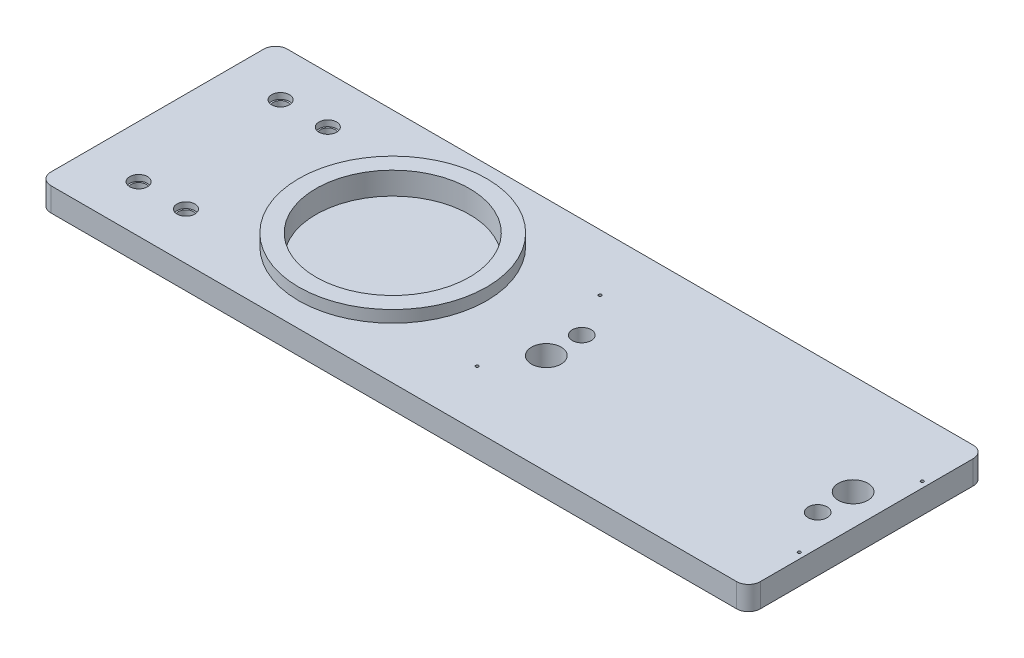
ISO-10303-21;
HEADER;
FILE_DESCRIPTION(('STEP AP214'),'2;1');
FILE_NAME('part.step','',(''),(''),'','','');
FILE_SCHEMA(('AUTOMOTIVE_DESIGN { 1 0 10303 214 1 1 1 1 }'));
ENDSEC;
DATA;
#1=APPLICATION_CONTEXT('core data for automotive mechanical design processes');
#2=APPLICATION_PROTOCOL_DEFINITION('international standard','automotive_design',2000,#1);
#3=PRODUCT_CONTEXT('',#1,'mechanical');
#4=PRODUCT('Part','Part','',(#3));
#5=PRODUCT_RELATED_PRODUCT_CATEGORY('part','',(#4));
#6=PRODUCT_DEFINITION_FORMATION('','',#4);
#7=PRODUCT_DEFINITION_CONTEXT('part definition',#1,'design');
#8=PRODUCT_DEFINITION('design','',#6,#7);
#9=PRODUCT_DEFINITION_SHAPE('','',#8);
#10=(LENGTH_UNIT() NAMED_UNIT(*) SI_UNIT(.MILLI.,.METRE.));
#11=(NAMED_UNIT(*) PLANE_ANGLE_UNIT() SI_UNIT($,.RADIAN.));
#12=(NAMED_UNIT(*) SI_UNIT($,.STERADIAN.) SOLID_ANGLE_UNIT());
#13=UNCERTAINTY_MEASURE_WITH_UNIT(LENGTH_MEASURE(1.E-05),#10,'distance_accuracy_value','');
#14=(GEOMETRIC_REPRESENTATION_CONTEXT(3) GLOBAL_UNCERTAINTY_ASSIGNED_CONTEXT((#13)) GLOBAL_UNIT_ASSIGNED_CONTEXT((#10,
#11,#12)) REPRESENTATION_CONTEXT('',''));
#15=CARTESIAN_POINT('',(0.,0.,0.));
#16=DIRECTION('',(0.,0.,1.));
#17=DIRECTION('',(1.,0.,0.));
#18=AXIS2_PLACEMENT_3D('',#15,#16,#17);
#19=CARTESIAN_POINT('',(-555.774,0.,-39.9999999999999));
#20=DIRECTION('',(0.,1.,0.));
#21=DIRECTION('',(0.,0.,1.));
#22=AXIS2_PLACEMENT_3D('',#19,#20,#21);
#23=CYLINDRICAL_SURFACE('',#22,6.25);
#24=CARTESIAN_POINT('',(-555.774,0.,-39.9999999999999));
#25=DIRECTION('',(0.,1.,0.));
#26=DIRECTION('',(0.,0.,1.));
#27=AXIS2_PLACEMENT_3D('',#24,#25,#26);
#28=CIRCLE('',#27,6.25);
#29=CARTESIAN_POINT('',(-555.774,0.,-33.7499999999999));
#30=VERTEX_POINT('',#29);
#31=EDGE_CURVE('E131',#30,#30,#28,.T.);
#32=ORIENTED_EDGE('',*,*,#31,.F.);
#33=EDGE_LOOP('',(#32));
#34=FACE_BOUND('',#33,.T.);
#35=CARTESIAN_POINT('',(-555.774,15.,-39.9999999999999));
#36=DIRECTION('',(0.,1.,0.));
#37=DIRECTION('',(0.,0.,1.));
#38=AXIS2_PLACEMENT_3D('',#35,#36,#37);
#39=CIRCLE('',#38,6.25);
#40=CARTESIAN_POINT('',(-555.774,15.,-33.7499999999999));
#41=VERTEX_POINT('',#40);
#42=EDGE_CURVE('E145',#41,#41,#39,.F.);
#43=ORIENTED_EDGE('',*,*,#42,.F.);
#44=EDGE_LOOP('',(#43));
#45=FACE_BOUND('',#44,.T.);
#46=ADVANCED_FACE('F33',(#34,#45),#23,.F.);
#47=CARTESIAN_POINT('',(-555.774,0.,-160.));
#48=DIRECTION('',(0.,1.,0.));
#49=DIRECTION('',(0.,0.,1.));
#50=AXIS2_PLACEMENT_3D('',#47,#48,#49);
#51=CYLINDRICAL_SURFACE('',#50,6.25);
#52=CARTESIAN_POINT('',(-555.774,0.,-160.));
#53=DIRECTION('',(0.,1.,0.));
#54=DIRECTION('',(0.,0.,1.));
#55=AXIS2_PLACEMENT_3D('',#52,#53,#54);
#56=CIRCLE('',#55,6.25);
#57=CARTESIAN_POINT('',(-555.774,0.,-153.75));
#58=VERTEX_POINT('',#57);
#59=EDGE_CURVE('E125',#58,#58,#56,.T.);
#60=ORIENTED_EDGE('',*,*,#59,.F.);
#61=EDGE_LOOP('',(#60));
#62=FACE_BOUND('',#61,.T.);
#63=CARTESIAN_POINT('',(-555.774,15.,-160.));
#64=DIRECTION('',(0.,1.,0.));
#65=DIRECTION('',(0.,0.,1.));
#66=AXIS2_PLACEMENT_3D('',#63,#64,#65);
#67=CIRCLE('',#66,6.25);
#68=CARTESIAN_POINT('',(-555.774,15.,-153.75));
#69=VERTEX_POINT('',#68);
#70=EDGE_CURVE('E140',#69,#69,#67,.F.);
#71=ORIENTED_EDGE('',*,*,#70,.F.);
#72=EDGE_LOOP('',(#71));
#73=FACE_BOUND('',#72,.T.);
#74=ADVANCED_FACE('F338',(#62,#73),#51,.F.);
#75=CARTESIAN_POINT('',(0.,20.,0.));
#76=DIRECTION('',(-1.,0.,0.));
#77=DIRECTION('',(0.,0.,1.));
#78=AXIS2_PLACEMENT_3D('',#75,#76,#77);
#79=PLANE('',#78);
#80=DIRECTION('',(0.,0.,-1.));
#81=VECTOR('',#80,1.);
#82=CARTESIAN_POINT('',(0.,20.,0.));
#83=LINE('',#82,#81);
#84=CARTESIAN_POINT('',(0.,20.,-10.));
#85=VERTEX_POINT('',#84);
#86=CARTESIAN_POINT('',(0.,20.,-190.));
#87=VERTEX_POINT('',#86);
#88=EDGE_CURVE('E118',#85,#87,#83,.T.);
#89=ORIENTED_EDGE('',*,*,#88,.F.);
#90=DIRECTION('',(0.,-1.,0.));
#91=VECTOR('',#90,1.);
#92=CARTESIAN_POINT('',(0.,20.,-10.));
#93=LINE('',#92,#91);
#94=CARTESIAN_POINT('',(0.,0.,-10.));
#95=VERTEX_POINT('',#94);
#96=EDGE_CURVE('E102',#85,#95,#93,.T.);
#97=ORIENTED_EDGE('',*,*,#96,.T.);
#98=DIRECTION('',(0.,0.,-1.));
#99=VECTOR('',#98,1.);
#100=CARTESIAN_POINT('',(0.,0.,0.));
#101=LINE('',#100,#99);
#102=CARTESIAN_POINT('',(0.,0.,-190.));
#103=VERTEX_POINT('',#102);
#104=EDGE_CURVE('E115',#95,#103,#101,.T.);
#105=ORIENTED_EDGE('',*,*,#104,.T.);
#106=DIRECTION('',(0.,-1.,0.));
#107=VECTOR('',#106,1.);
#108=CARTESIAN_POINT('',(0.,20.,-190.));
#109=LINE('',#108,#107);
#110=EDGE_CURVE('E120',#103,#87,#109,.F.);
#111=ORIENTED_EDGE('',*,*,#110,.T.);
#112=EDGE_LOOP('',(#89,#97,#105,#111));
#113=FACE_BOUND('',#112,.T.);
#114=ADVANCED_FACE('F114',(#113),#79,.F.);
#115=CARTESIAN_POINT('',(0.,20.,-200.));
#116=DIRECTION('',(0.,0.,1.));
#117=DIRECTION('',(1.,0.,0.));
#118=AXIS2_PLACEMENT_3D('',#115,#116,#117);
#119=PLANE('',#118);
#120=DIRECTION('',(-1.,0.,0.));
#121=VECTOR('',#120,1.);
#122=CARTESIAN_POINT('',(0.,20.,-200.));
#123=LINE('',#122,#121);
#124=CARTESIAN_POINT('',(-10.,20.,-200.));
#125=VERTEX_POINT('',#124);
#126=CARTESIAN_POINT('',(-590.,20.,-200.));
#127=VERTEX_POINT('',#126);
#128=EDGE_CURVE('E189',#125,#127,#123,.T.);
#129=ORIENTED_EDGE('',*,*,#128,.F.);
#130=DIRECTION('',(0.,-1.,0.));
#131=VECTOR('',#130,1.);
#132=CARTESIAN_POINT('',(-10.,20.,-200.));
#133=LINE('',#132,#131);
#134=CARTESIAN_POINT('',(-10.,0.,-200.));
#135=VERTEX_POINT('',#134);
#136=EDGE_CURVE('E173',#125,#135,#133,.T.);
#137=ORIENTED_EDGE('',*,*,#136,.T.);
#138=DIRECTION('',(-1.,0.,0.));
#139=VECTOR('',#138,1.);
#140=CARTESIAN_POINT('',(0.,0.,-200.));
#141=LINE('',#140,#139);
#142=CARTESIAN_POINT('',(-590.,0.,-200.));
#143=VERTEX_POINT('',#142);
#144=EDGE_CURVE('E124',#135,#143,#141,.T.);
#145=ORIENTED_EDGE('',*,*,#144,.T.);
#146=DIRECTION('',(0.,-1.,0.));
#147=VECTOR('',#146,1.);
#148=CARTESIAN_POINT('',(-590.,20.,-200.));
#149=LINE('',#148,#147);
#150=EDGE_CURVE('E171',#143,#127,#149,.F.);
#151=ORIENTED_EDGE('',*,*,#150,.T.);
#152=EDGE_LOOP('',(#129,#137,#145,#151));
#153=FACE_BOUND('',#152,.T.);
#154=ADVANCED_FACE('F361',(#153),#119,.F.);
#155=CARTESIAN_POINT('',(-600.,20.,0.));
#156=DIRECTION('',(1.,0.,0.));
#157=DIRECTION('',(0.,0.,-1.));
#158=AXIS2_PLACEMENT_3D('',#155,#156,#157);
#159=PLANE('',#158);
#160=DIRECTION('',(0.,0.,1.));
#161=VECTOR('',#160,1.);
#162=CARTESIAN_POINT('',(-600.,0.,0.));
#163=LINE('',#162,#161);
#164=CARTESIAN_POINT('',(-600.,0.,-190.));
#165=VERTEX_POINT('',#164);
#166=CARTESIAN_POINT('',(-600.,0.,-9.99999999999992));
#167=VERTEX_POINT('',#166);
#168=EDGE_CURVE('E128',#165,#167,#163,.T.);
#169=ORIENTED_EDGE('',*,*,#168,.T.);
#170=DIRECTION('',(0.,-1.,0.));
#171=VECTOR('',#170,1.);
#172=CARTESIAN_POINT('',(-600.,20.,-9.99999999999993));
#173=LINE('',#172,#171);
#174=CARTESIAN_POINT('',(-600.,20.,-9.99999999999992));
#175=VERTEX_POINT('',#174);
#176=EDGE_CURVE('E11',#167,#175,#173,.F.);
#177=ORIENTED_EDGE('',*,*,#176,.T.);
#178=DIRECTION('',(0.,0.,1.));
#179=VECTOR('',#178,1.);
#180=CARTESIAN_POINT('',(-600.,20.,0.));
#181=LINE('',#180,#179);
#182=CARTESIAN_POINT('',(-600.,20.,-190.));
#183=VERTEX_POINT('',#182);
#184=EDGE_CURVE('E179',#183,#175,#181,.T.);
#185=ORIENTED_EDGE('',*,*,#184,.F.);
#186=DIRECTION('',(0.,-1.,0.));
#187=VECTOR('',#186,1.);
#188=CARTESIAN_POINT('',(-600.,20.,-190.));
#189=LINE('',#188,#187);
#190=EDGE_CURVE('E41',#183,#165,#189,.T.);
#191=ORIENTED_EDGE('',*,*,#190,.T.);
#192=EDGE_LOOP('',(#169,#177,#185,#191));
#193=FACE_BOUND('',#192,.T.);
#194=ADVANCED_FACE('F178',(#193),#159,.F.);
#195=CARTESIAN_POINT('',(0.,20.,0.));
#196=DIRECTION('',(0.,0.,-1.));
#197=DIRECTION('',(-1.,0.,0.));
#198=AXIS2_PLACEMENT_3D('',#195,#196,#197);
#199=PLANE('',#198);
#200=DIRECTION('',(1.,0.,0.));
#201=VECTOR('',#200,1.);
#202=CARTESIAN_POINT('',(0.,0.,0.));
#203=LINE('',#202,#201);
#204=CARTESIAN_POINT('',(-590.,0.,0.));
#205=VERTEX_POINT('',#204);
#206=CARTESIAN_POINT('',(-10.,0.,0.));
#207=VERTEX_POINT('',#206);
#208=EDGE_CURVE('E138',#205,#207,#203,.T.);
#209=ORIENTED_EDGE('',*,*,#208,.T.);
#210=DIRECTION('',(0.,-1.,0.));
#211=VECTOR('',#210,1.);
#212=CARTESIAN_POINT('',(-10.,20.,0.));
#213=LINE('',#212,#211);
#214=CARTESIAN_POINT('',(-10.,20.,0.));
#215=VERTEX_POINT('',#214);
#216=EDGE_CURVE('E103',#207,#215,#213,.F.);
#217=ORIENTED_EDGE('',*,*,#216,.T.);
#218=DIRECTION('',(1.,0.,0.));
#219=VECTOR('',#218,1.);
#220=CARTESIAN_POINT('',(0.,20.,0.));
#221=LINE('',#220,#219);
#222=CARTESIAN_POINT('',(-590.,20.,0.));
#223=VERTEX_POINT('',#222);
#224=EDGE_CURVE('E134',#223,#215,#221,.T.);
#225=ORIENTED_EDGE('',*,*,#224,.F.);
#226=DIRECTION('',(0.,-1.,0.));
#227=VECTOR('',#226,1.);
#228=CARTESIAN_POINT('',(-590.,20.,0.));
#229=LINE('',#228,#227);
#230=EDGE_CURVE('E108',#223,#205,#229,.T.);
#231=ORIENTED_EDGE('',*,*,#230,.T.);
#232=EDGE_LOOP('',(#209,#217,#225,#231));
#233=FACE_BOUND('',#232,.T.);
#234=ADVANCED_FACE('F187',(#233),#199,.F.);
#235=CARTESIAN_POINT('',(0.,20.,0.));
#236=DIRECTION('',(0.,1.,0.));
#237=DIRECTION('',(0.,0.,1.));
#238=AXIS2_PLACEMENT_3D('',#235,#236,#237);
#239=PLANE('',#238);
#240=CARTESIAN_POINT('',(-26.5,20.,-85.));
#241=DIRECTION('',(0.,1.,0.));
#242=DIRECTION('',(0.,0.,1.));
#243=AXIS2_PLACEMENT_3D('',#240,#241,#242);
#244=CIRCLE('',#243,8.);
#245=CARTESIAN_POINT('',(-26.5,20.,-77.));
#246=VERTEX_POINT('',#245);
#247=EDGE_CURVE('E276',#246,#246,#244,.T.);
#248=ORIENTED_EDGE('',*,*,#247,.F.);
#249=EDGE_LOOP('',(#248));
#250=FACE_BOUND('',#249,.T.);
#251=CARTESIAN_POINT('',(-256.,20.,-115.));
#252=DIRECTION('',(0.,1.,0.));
#253=DIRECTION('',(0.,0.,1.));
#254=AXIS2_PLACEMENT_3D('',#251,#252,#253);
#255=CIRCLE('',#254,8.00000000000001);
#256=CARTESIAN_POINT('',(-256.,20.,-107.));
#257=VERTEX_POINT('',#256);
#258=EDGE_CURVE('E270',#257,#257,#255,.T.);
#259=ORIENTED_EDGE('',*,*,#258,.F.);
#260=EDGE_LOOP('',(#259));
#261=FACE_BOUND('',#260,.T.);
#262=CARTESIAN_POINT('',(-256.,20.,-85.));
#263=DIRECTION('',(0.,1.,0.));
#264=DIRECTION('',(0.,0.,1.));
#265=AXIS2_PLACEMENT_3D('',#262,#263,#264);
#266=CIRCLE('',#265,12.5);
#267=CARTESIAN_POINT('',(-256.,20.,-72.5));
#268=VERTEX_POINT('',#267);
#269=EDGE_CURVE('E264',#268,#268,#266,.T.);
#270=ORIENTED_EDGE('',*,*,#269,.F.);
#271=EDGE_LOOP('',(#270));
#272=FACE_BOUND('',#271,.T.);
#273=CARTESIAN_POINT('',(-26.5,20.,-115.));
#274=DIRECTION('',(0.,1.,0.));
#275=DIRECTION('',(0.,0.,1.));
#276=AXIS2_PLACEMENT_3D('',#273,#274,#275);
#277=CIRCLE('',#276,12.5);
#278=CARTESIAN_POINT('',(-26.5,20.,-102.5));
#279=VERTEX_POINT('',#278);
#280=EDGE_CURVE('E258',#279,#279,#277,.T.);
#281=ORIENTED_EDGE('',*,*,#280,.F.);
#282=EDGE_LOOP('',(#281));
#283=FACE_BOUND('',#282,.T.);
#284=CARTESIAN_POINT('',(-400.86710702331,20.,-99.9999999999999));
#285=DIRECTION('',(0.,1.,0.));
#286=DIRECTION('',(0.,0.,1.));
#287=AXIS2_PLACEMENT_3D('',#284,#285,#286);
#288=CIRCLE('',#287,79.491583247583);
#289=CARTESIAN_POINT('',(-400.86710702331,20.,-20.508416752417));
#290=VERTEX_POINT('',#289);
#291=EDGE_CURVE('E246',#290,#290,#288,.T.);
#292=ORIENTED_EDGE('',*,*,#291,.F.);
#293=EDGE_LOOP('',(#292));
#294=FACE_BOUND('',#293,.T.);
#295=CARTESIAN_POINT('',(-277.5,20.,-152.));
#296=DIRECTION('',(0.,1.,0.));
#297=DIRECTION('',(0.,0.,-1.));
#298=AXIS2_PLACEMENT_3D('',#295,#296,#297);
#299=CIRCLE('',#298,1.24999999999995);
#300=CARTESIAN_POINT('',(-277.5,20.,-153.25));
#301=VERTEX_POINT('',#300);
#302=EDGE_CURVE('E241',#301,#301,#299,.T.);
#303=ORIENTED_EDGE('',*,*,#302,.F.);
#304=EDGE_LOOP('',(#303));
#305=FACE_BOUND('',#304,.T.);
#306=CARTESIAN_POINT('',(-5.,20.,-47.9999999999999));
#307=DIRECTION('',(0.,1.,0.));
#308=DIRECTION('',(0.,0.,-1.));
#309=AXIS2_PLACEMENT_3D('',#306,#307,#308);
#310=CIRCLE('',#309,1.24999999999996);
#311=CARTESIAN_POINT('',(-5.,20.,-49.2499999999999));
#312=VERTEX_POINT('',#311);
#313=EDGE_CURVE('E235',#312,#312,#310,.T.);
#314=ORIENTED_EDGE('',*,*,#313,.F.);
#315=EDGE_LOOP('',(#314));
#316=FACE_BOUND('',#315,.T.);
#317=CARTESIAN_POINT('',(-5.,20.,-152.));
#318=DIRECTION('',(0.,1.,0.));
#319=DIRECTION('',(0.,0.,1.));
#320=AXIS2_PLACEMENT_3D('',#317,#318,#319);
#321=CIRCLE('',#320,1.24999999999995);
#322=CARTESIAN_POINT('',(-5.,20.,-150.75));
#323=VERTEX_POINT('',#322);
#324=EDGE_CURVE('E228',#323,#323,#321,.T.);
#325=ORIENTED_EDGE('',*,*,#324,.F.);
#326=EDGE_LOOP('',(#325));
#327=FACE_BOUND('',#326,.T.);
#328=CARTESIAN_POINT('',(-277.5,20.,-47.9999999999999));
#329=DIRECTION('',(0.,1.,0.));
#330=DIRECTION('',(0.,0.,1.));
#331=AXIS2_PLACEMENT_3D('',#328,#329,#330);
#332=CIRCLE('',#331,1.24999999999996);
#333=CARTESIAN_POINT('',(-277.5,20.,-46.75));
#334=VERTEX_POINT('',#333);
#335=EDGE_CURVE('E222',#334,#334,#332,.T.);
#336=ORIENTED_EDGE('',*,*,#335,.F.);
#337=EDGE_LOOP('',(#336));
#338=FACE_BOUND('',#337,.T.);
#339=CARTESIAN_POINT('',(-555.774,20.,-39.9999999999999));
#340=DIRECTION('',(0.,1.,0.));
#341=DIRECTION('',(0.,0.,1.));
#342=AXIS2_PLACEMENT_3D('',#339,#340,#341);
#343=CIRCLE('',#342,7.50000000000007);
#344=CARTESIAN_POINT('',(-555.774,20.,-32.4999999999999));
#345=VERTEX_POINT('',#344);
#346=EDGE_CURVE('E217',#345,#345,#343,.T.);
#347=ORIENTED_EDGE('',*,*,#346,.F.);
#348=EDGE_LOOP('',(#347));
#349=FACE_BOUND('',#348,.T.);
#350=CARTESIAN_POINT('',(-515.774,20.,-39.9999999999999));
#351=DIRECTION('',(0.,1.,0.));
#352=DIRECTION('',(0.,0.,-1.));
#353=AXIS2_PLACEMENT_3D('',#350,#351,#352);
#354=CIRCLE('',#353,7.50000000000007);
#355=CARTESIAN_POINT('',(-515.774,20.,-47.5));
#356=VERTEX_POINT('',#355);
#357=EDGE_CURVE('E211',#356,#356,#354,.T.);
#358=ORIENTED_EDGE('',*,*,#357,.F.);
#359=EDGE_LOOP('',(#358));
#360=FACE_BOUND('',#359,.T.);
#361=CARTESIAN_POINT('',(-515.774,20.,-160.));
#362=DIRECTION('',(0.,1.,0.));
#363=DIRECTION('',(0.,0.,-1.));
#364=AXIS2_PLACEMENT_3D('',#361,#362,#363);
#365=CIRCLE('',#364,7.50000000000007);
#366=CARTESIAN_POINT('',(-515.774,20.,-167.5));
#367=VERTEX_POINT('',#366);
#368=EDGE_CURVE('E204',#367,#367,#365,.T.);
#369=ORIENTED_EDGE('',*,*,#368,.F.);
#370=EDGE_LOOP('',(#369));
#371=FACE_BOUND('',#370,.T.);
#372=CARTESIAN_POINT('',(-555.774,20.,-160.));
#373=DIRECTION('',(0.,1.,0.));
#374=DIRECTION('',(0.,0.,1.));
#375=AXIS2_PLACEMENT_3D('',#372,#373,#374);
#376=CIRCLE('',#375,7.50000000000007);
#377=CARTESIAN_POINT('',(-555.774,20.,-152.5));
#378=VERTEX_POINT('',#377);
#379=EDGE_CURVE('E155',#378,#378,#376,.T.);
#380=ORIENTED_EDGE('',*,*,#379,.F.);
#381=EDGE_LOOP('',(#380));
#382=FACE_BOUND('',#381,.T.);
#383=ORIENTED_EDGE('',*,*,#224,.T.);
#384=CARTESIAN_POINT('',(-10.,20.,-10.));
#385=DIRECTION('',(0.,1.,0.));
#386=DIRECTION('',(0.,0.,1.));
#387=AXIS2_PLACEMENT_3D('',#384,#385,#386);
#388=CIRCLE('',#387,10.);
#389=EDGE_CURVE('E169',#215,#85,#388,.T.);
#390=ORIENTED_EDGE('',*,*,#389,.T.);
#391=ORIENTED_EDGE('',*,*,#88,.T.);
#392=CARTESIAN_POINT('',(-10.,20.,-190.));
#393=DIRECTION('',(0.,1.,0.));
#394=DIRECTION('',(0.,0.,1.));
#395=AXIS2_PLACEMENT_3D('',#392,#393,#394);
#396=CIRCLE('',#395,10.);
#397=EDGE_CURVE('E167',#87,#125,#396,.T.);
#398=ORIENTED_EDGE('',*,*,#397,.T.);
#399=ORIENTED_EDGE('',*,*,#128,.T.);
#400=CARTESIAN_POINT('',(-590.,20.,-190.));
#401=DIRECTION('',(0.,1.,0.));
#402=DIRECTION('',(0.,0.,1.));
#403=AXIS2_PLACEMENT_3D('',#400,#401,#402);
#404=CIRCLE('',#403,10.);
#405=EDGE_CURVE('E53',#127,#183,#404,.T.);
#406=ORIENTED_EDGE('',*,*,#405,.T.);
#407=ORIENTED_EDGE('',*,*,#184,.T.);
#408=CARTESIAN_POINT('',(-590.,20.,-9.99999999999993));
#409=DIRECTION('',(0.,1.,0.));
#410=DIRECTION('',(0.,0.,1.));
#411=AXIS2_PLACEMENT_3D('',#408,#409,#410);
#412=CIRCLE('',#411,10.);
#413=EDGE_CURVE('E165',#175,#223,#412,.T.);
#414=ORIENTED_EDGE('',*,*,#413,.T.);
#415=EDGE_LOOP('',(#383,#390,#391,#398,#399,#406,#407,#414));
#416=FACE_BOUND('',#415,.T.);
#417=ADVANCED_FACE('F291',(#250,#261,#272,#283,#294,#305,#316,#327,#338,#349,#360,#371,#382,
#416),#239,.T.);
#418=CARTESIAN_POINT('',(0.,0.,0.));
#419=DIRECTION('',(0.,1.,0.));
#420=DIRECTION('',(0.,0.,1.));
#421=AXIS2_PLACEMENT_3D('',#418,#419,#420);
#422=PLANE('',#421);
#423=CARTESIAN_POINT('',(-26.5,0.,-85.));
#424=DIRECTION('',(0.,1.,0.));
#425=DIRECTION('',(0.,0.,1.));
#426=AXIS2_PLACEMENT_3D('',#423,#424,#425);
#427=CIRCLE('',#426,8.);
#428=CARTESIAN_POINT('',(-26.5,0.,-77.));
#429=VERTEX_POINT('',#428);
#430=EDGE_CURVE('E261',#429,#429,#427,.T.);
#431=ORIENTED_EDGE('',*,*,#430,.T.);
#432=EDGE_LOOP('',(#431));
#433=FACE_BOUND('',#432,.T.);
#434=CARTESIAN_POINT('',(-256.,0.,-115.));
#435=DIRECTION('',(0.,1.,0.));
#436=DIRECTION('',(0.,0.,1.));
#437=AXIS2_PLACEMENT_3D('',#434,#435,#436);
#438=CIRCLE('',#437,8.00000000000001);
#439=CARTESIAN_POINT('',(-256.,0.,-107.));
#440=VERTEX_POINT('',#439);
#441=EDGE_CURVE('E273',#440,#440,#438,.T.);
#442=ORIENTED_EDGE('',*,*,#441,.T.);
#443=EDGE_LOOP('',(#442));
#444=FACE_BOUND('',#443,.T.);
#445=CARTESIAN_POINT('',(-256.,0.,-85.));
#446=DIRECTION('',(0.,1.,0.));
#447=DIRECTION('',(0.,0.,1.));
#448=AXIS2_PLACEMENT_3D('',#445,#446,#447);
#449=CIRCLE('',#448,12.5);
#450=CARTESIAN_POINT('',(-256.,0.,-72.5));
#451=VERTEX_POINT('',#450);
#452=EDGE_CURVE('E267',#451,#451,#449,.T.);
#453=ORIENTED_EDGE('',*,*,#452,.T.);
#454=EDGE_LOOP('',(#453));
#455=FACE_BOUND('',#454,.T.);
#456=CARTESIAN_POINT('',(-26.5,0.,-115.));
#457=DIRECTION('',(0.,1.,0.));
#458=DIRECTION('',(0.,0.,1.));
#459=AXIS2_PLACEMENT_3D('',#456,#457,#458);
#460=CIRCLE('',#459,12.5);
#461=CARTESIAN_POINT('',(-26.5,0.,-102.5));
#462=VERTEX_POINT('',#461);
#463=EDGE_CURVE('E255',#462,#462,#460,.T.);
#464=ORIENTED_EDGE('',*,*,#463,.T.);
#465=EDGE_LOOP('',(#464));
#466=FACE_BOUND('',#465,.T.);
#467=CARTESIAN_POINT('',(-277.5,0.,-152.));
#468=DIRECTION('',(0.,1.,0.));
#469=DIRECTION('',(0.,0.,-1.));
#470=AXIS2_PLACEMENT_3D('',#467,#468,#469);
#471=CIRCLE('',#470,1.24999999999995);
#472=CARTESIAN_POINT('',(-277.5,0.,-153.25));
#473=VERTEX_POINT('',#472);
#474=EDGE_CURVE('E225',#473,#473,#471,.T.);
#475=ORIENTED_EDGE('',*,*,#474,.T.);
#476=EDGE_LOOP('',(#475));
#477=FACE_BOUND('',#476,.T.);
#478=CARTESIAN_POINT('',(-5.,0.,-47.9999999999999));
#479=DIRECTION('',(0.,1.,0.));
#480=DIRECTION('',(0.,0.,-1.));
#481=AXIS2_PLACEMENT_3D('',#478,#479,#480);
#482=CIRCLE('',#481,1.24999999999996);
#483=CARTESIAN_POINT('',(-5.,0.,-49.2499999999999));
#484=VERTEX_POINT('',#483);
#485=EDGE_CURVE('E238',#484,#484,#482,.T.);
#486=ORIENTED_EDGE('',*,*,#485,.T.);
#487=EDGE_LOOP('',(#486));
#488=FACE_BOUND('',#487,.T.);
#489=CARTESIAN_POINT('',(-5.,0.,-152.));
#490=DIRECTION('',(0.,1.,0.));
#491=DIRECTION('',(0.,0.,1.));
#492=AXIS2_PLACEMENT_3D('',#489,#490,#491);
#493=CIRCLE('',#492,1.24999999999995);
#494=CARTESIAN_POINT('',(-5.,0.,-150.75));
#495=VERTEX_POINT('',#494);
#496=EDGE_CURVE('E231',#495,#495,#493,.T.);
#497=ORIENTED_EDGE('',*,*,#496,.T.);
#498=EDGE_LOOP('',(#497));
#499=FACE_BOUND('',#498,.T.);
#500=CARTESIAN_POINT('',(-277.5,0.,-47.9999999999999));
#501=DIRECTION('',(0.,1.,0.));
#502=DIRECTION('',(0.,0.,1.));
#503=AXIS2_PLACEMENT_3D('',#500,#501,#502);
#504=CIRCLE('',#503,1.24999999999996);
#505=CARTESIAN_POINT('',(-277.5,0.,-46.75));
#506=VERTEX_POINT('',#505);
#507=EDGE_CURVE('E208',#506,#506,#504,.T.);
#508=ORIENTED_EDGE('',*,*,#507,.T.);
#509=EDGE_LOOP('',(#508));
#510=FACE_BOUND('',#509,.T.);
#511=ORIENTED_EDGE('',*,*,#31,.T.);
#512=EDGE_LOOP('',(#511));
#513=FACE_BOUND('',#512,.T.);
#514=CARTESIAN_POINT('',(-515.774,0.,-39.9999999999999));
#515=DIRECTION('',(0.,1.,0.));
#516=DIRECTION('',(0.,0.,-1.));
#517=AXIS2_PLACEMENT_3D('',#514,#515,#516);
#518=CIRCLE('',#517,6.25);
#519=CARTESIAN_POINT('',(-515.774,0.,-46.2499999999999));
#520=VERTEX_POINT('',#519);
#521=EDGE_CURVE('E195',#520,#520,#518,.T.);
#522=ORIENTED_EDGE('',*,*,#521,.T.);
#523=EDGE_LOOP('',(#522));
#524=FACE_BOUND('',#523,.T.);
#525=CARTESIAN_POINT('',(-515.774,0.,-160.));
#526=DIRECTION('',(0.,1.,0.));
#527=DIRECTION('',(0.,0.,-1.));
#528=AXIS2_PLACEMENT_3D('',#525,#526,#527);
#529=CIRCLE('',#528,6.25);
#530=CARTESIAN_POINT('',(-515.774,0.,-166.25));
#531=VERTEX_POINT('',#530);
#532=EDGE_CURVE('E143',#531,#531,#529,.T.);
#533=ORIENTED_EDGE('',*,*,#532,.T.);
#534=EDGE_LOOP('',(#533));
#535=FACE_BOUND('',#534,.T.);
#536=ORIENTED_EDGE('',*,*,#59,.T.);
#537=EDGE_LOOP('',(#536));
#538=FACE_BOUND('',#537,.T.);
#539=ORIENTED_EDGE('',*,*,#104,.F.);
#540=CARTESIAN_POINT('',(-10.,0.,-10.));
#541=DIRECTION('',(0.,1.,0.));
#542=DIRECTION('',(0.,0.,1.));
#543=AXIS2_PLACEMENT_3D('',#540,#541,#542);
#544=CIRCLE('',#543,10.);
#545=EDGE_CURVE('E98',#95,#207,#544,.F.);
#546=ORIENTED_EDGE('',*,*,#545,.T.);
#547=ORIENTED_EDGE('',*,*,#208,.F.);
#548=CARTESIAN_POINT('',(-590.,0.,-9.99999999999993));
#549=DIRECTION('',(0.,1.,0.));
#550=DIRECTION('',(0.,0.,1.));
#551=AXIS2_PLACEMENT_3D('',#548,#549,#550);
#552=CIRCLE('',#551,10.);
#553=EDGE_CURVE('E158',#205,#167,#552,.F.);
#554=ORIENTED_EDGE('',*,*,#553,.T.);
#555=ORIENTED_EDGE('',*,*,#168,.F.);
#556=CARTESIAN_POINT('',(-590.,0.,-190.));
#557=DIRECTION('',(0.,1.,0.));
#558=DIRECTION('',(0.,0.,1.));
#559=AXIS2_PLACEMENT_3D('',#556,#557,#558);
#560=CIRCLE('',#559,10.);
#561=EDGE_CURVE('E119',#165,#143,#560,.F.);
#562=ORIENTED_EDGE('',*,*,#561,.T.);
#563=ORIENTED_EDGE('',*,*,#144,.F.);
#564=CARTESIAN_POINT('',(-10.,0.,-190.));
#565=DIRECTION('',(0.,1.,0.));
#566=DIRECTION('',(0.,0.,1.));
#567=AXIS2_PLACEMENT_3D('',#564,#565,#566);
#568=CIRCLE('',#567,10.);
#569=EDGE_CURVE('E109',#135,#103,#568,.F.);
#570=ORIENTED_EDGE('',*,*,#569,.T.);
#571=EDGE_LOOP('',(#539,#546,#547,#554,#555,#562,#563,#570));
#572=FACE_BOUND('',#571,.T.);
#573=ADVANCED_FACE('F122',(#433,#444,#455,#466,#477,#488,#499,#510,#513,#524,#535,#538,#572),
#422,.F.);
#574=CARTESIAN_POINT('',(-515.774,0.,-160.));
#575=DIRECTION('',(0.,1.,0.));
#576=DIRECTION('',(0.,0.,1.));
#577=AXIS2_PLACEMENT_3D('',#574,#575,#576);
#578=CYLINDRICAL_SURFACE('',#577,6.25);
#579=CARTESIAN_POINT('',(-515.774,15.,-160.));
#580=DIRECTION('',(0.,-1.,0.));
#581=DIRECTION('',(0.,0.,-1.));
#582=AXIS2_PLACEMENT_3D('',#579,#580,#581);
#583=CIRCLE('',#582,6.25);
#584=CARTESIAN_POINT('',(-515.774,15.,-166.25));
#585=VERTEX_POINT('',#584);
#586=EDGE_CURVE('E152',#585,#585,#583,.F.);
#587=ORIENTED_EDGE('',*,*,#586,.T.);
#588=EDGE_LOOP('',(#587));
#589=FACE_BOUND('',#588,.T.);
#590=ORIENTED_EDGE('',*,*,#532,.F.);
#591=EDGE_LOOP('',(#590));
#592=FACE_BOUND('',#591,.T.);
#593=ADVANCED_FACE('F350',(#589,#592),#578,.F.);
#594=CARTESIAN_POINT('',(-515.774,0.,-39.9999999999999));
#595=DIRECTION('',(0.,1.,0.));
#596=DIRECTION('',(0.,0.,1.));
#597=AXIS2_PLACEMENT_3D('',#594,#595,#596);
#598=CYLINDRICAL_SURFACE('',#597,6.25);
#599=CARTESIAN_POINT('',(-515.774,15.,-39.9999999999999));
#600=DIRECTION('',(0.,-1.,0.));
#601=DIRECTION('',(0.,0.,-1.));
#602=AXIS2_PLACEMENT_3D('',#599,#600,#601);
#603=CIRCLE('',#602,6.25);
#604=CARTESIAN_POINT('',(-515.774,15.,-46.2499999999999));
#605=VERTEX_POINT('',#604);
#606=EDGE_CURVE('E148',#605,#605,#603,.F.);
#607=ORIENTED_EDGE('',*,*,#606,.T.);
#608=EDGE_LOOP('',(#607));
#609=FACE_BOUND('',#608,.T.);
#610=ORIENTED_EDGE('',*,*,#521,.F.);
#611=EDGE_LOOP('',(#610));
#612=FACE_BOUND('',#611,.T.);
#613=ADVANCED_FACE('F332',(#609,#612),#598,.F.);
#614=CARTESIAN_POINT('',(-555.774,15.,-160.));
#615=DIRECTION('',(0.,1.,0.));
#616=DIRECTION('',(0.,0.,1.));
#617=AXIS2_PLACEMENT_3D('',#614,#615,#616);
#618=PLANE('',#617);
#619=CARTESIAN_POINT('',(-555.774,15.,-160.));
#620=DIRECTION('',(0.,1.,0.));
#621=DIRECTION('',(0.,0.,1.));
#622=AXIS2_PLACEMENT_3D('',#619,#620,#621);
#623=CIRCLE('',#622,7.50000000000007);
#624=CARTESIAN_POINT('',(-555.774,15.,-152.5));
#625=VERTEX_POINT('',#624);
#626=EDGE_CURVE('E144',#625,#625,#623,.T.);
#627=ORIENTED_EDGE('',*,*,#626,.T.);
#628=EDGE_LOOP('',(#627));
#629=FACE_BOUND('',#628,.T.);
#630=ORIENTED_EDGE('',*,*,#70,.T.);
#631=EDGE_LOOP('',(#630));
#632=FACE_BOUND('',#631,.T.);
#633=ADVANCED_FACE('F322',(#629,#632),#618,.T.);
#634=CARTESIAN_POINT('',(-555.774,15.,-160.));
#635=DIRECTION('',(0.,1.,0.));
#636=DIRECTION('',(0.,0.,1.));
#637=AXIS2_PLACEMENT_3D('',#634,#635,#636);
#638=CYLINDRICAL_SURFACE('',#637,7.50000000000007);
#639=ORIENTED_EDGE('',*,*,#626,.F.);
#640=EDGE_LOOP('',(#639));
#641=FACE_BOUND('',#640,.T.);
#642=ORIENTED_EDGE('',*,*,#379,.T.);
#643=EDGE_LOOP('',(#642));
#644=FACE_BOUND('',#643,.T.);
#645=ADVANCED_FACE('F319',(#641,#644),#638,.F.);
#646=CARTESIAN_POINT('',(-555.774,15.,-39.9999999999999));
#647=DIRECTION('',(0.,1.,0.));
#648=DIRECTION('',(0.,0.,1.));
#649=AXIS2_PLACEMENT_3D('',#646,#647,#648);
#650=PLANE('',#649);
#651=CARTESIAN_POINT('',(-555.774,15.,-39.9999999999999));
#652=DIRECTION('',(0.,1.,0.));
#653=DIRECTION('',(0.,0.,1.));
#654=AXIS2_PLACEMENT_3D('',#651,#652,#653);
#655=CIRCLE('',#654,7.50000000000007);
#656=CARTESIAN_POINT('',(-555.774,15.,-32.4999999999999));
#657=VERTEX_POINT('',#656);
#658=EDGE_CURVE('E149',#657,#657,#655,.T.);
#659=ORIENTED_EDGE('',*,*,#658,.T.);
#660=EDGE_LOOP('',(#659));
#661=FACE_BOUND('',#660,.T.);
#662=ORIENTED_EDGE('',*,*,#42,.T.);
#663=EDGE_LOOP('',(#662));
#664=FACE_BOUND('',#663,.T.);
#665=ADVANCED_FACE('F321',(#661,#664),#650,.T.);
#666=CARTESIAN_POINT('',(-555.774,15.,-39.9999999999999));
#667=DIRECTION('',(0.,1.,0.));
#668=DIRECTION('',(0.,0.,1.));
#669=AXIS2_PLACEMENT_3D('',#666,#667,#668);
#670=CYLINDRICAL_SURFACE('',#669,7.50000000000007);
#671=ORIENTED_EDGE('',*,*,#658,.F.);
#672=EDGE_LOOP('',(#671));
#673=FACE_BOUND('',#672,.T.);
#674=ORIENTED_EDGE('',*,*,#346,.T.);
#675=EDGE_LOOP('',(#674));
#676=FACE_BOUND('',#675,.T.);
#677=ADVANCED_FACE('F329',(#673,#676),#670,.F.);
#678=CARTESIAN_POINT('',(-515.774,15.,-39.9999999999999));
#679=DIRECTION('',(0.,-1.,0.));
#680=DIRECTION('',(0.,0.,-1.));
#681=AXIS2_PLACEMENT_3D('',#678,#679,#680);
#682=PLANE('',#681);
#683=CARTESIAN_POINT('',(-515.774,15.,-39.9999999999999));
#684=DIRECTION('',(0.,1.,0.));
#685=DIRECTION('',(0.,0.,-1.));
#686=AXIS2_PLACEMENT_3D('',#683,#684,#685);
#687=CIRCLE('',#686,7.50000000000007);
#688=CARTESIAN_POINT('',(-515.774,15.,-47.5));
#689=VERTEX_POINT('',#688);
#690=EDGE_CURVE('E214',#689,#689,#687,.T.);
#691=ORIENTED_EDGE('',*,*,#690,.T.);
#692=EDGE_LOOP('',(#691));
#693=FACE_BOUND('',#692,.T.);
#694=ORIENTED_EDGE('',*,*,#606,.F.);
#695=EDGE_LOOP('',(#694));
#696=FACE_BOUND('',#695,.T.);
#697=ADVANCED_FACE('F416',(#693,#696),#682,.F.);
#698=CARTESIAN_POINT('',(-515.774,15.,-39.9999999999999));
#699=DIRECTION('',(0.,1.,0.));
#700=DIRECTION('',(0.,0.,1.));
#701=AXIS2_PLACEMENT_3D('',#698,#699,#700);
#702=CYLINDRICAL_SURFACE('',#701,7.50000000000007);
#703=ORIENTED_EDGE('',*,*,#690,.F.);
#704=EDGE_LOOP('',(#703));
#705=FACE_BOUND('',#704,.T.);
#706=ORIENTED_EDGE('',*,*,#357,.T.);
#707=EDGE_LOOP('',(#706));
#708=FACE_BOUND('',#707,.T.);
#709=ADVANCED_FACE('F420',(#705,#708),#702,.F.);
#710=CARTESIAN_POINT('',(-515.774,15.,-160.));
#711=DIRECTION('',(0.,-1.,0.));
#712=DIRECTION('',(0.,0.,-1.));
#713=AXIS2_PLACEMENT_3D('',#710,#711,#712);
#714=PLANE('',#713);
#715=CARTESIAN_POINT('',(-515.774,15.,-160.));
#716=DIRECTION('',(0.,1.,0.));
#717=DIRECTION('',(0.,0.,-1.));
#718=AXIS2_PLACEMENT_3D('',#715,#716,#717);
#719=CIRCLE('',#718,7.50000000000007);
#720=CARTESIAN_POINT('',(-515.774,15.,-167.5));
#721=VERTEX_POINT('',#720);
#722=EDGE_CURVE('E207',#721,#721,#719,.T.);
#723=ORIENTED_EDGE('',*,*,#722,.T.);
#724=EDGE_LOOP('',(#723));
#725=FACE_BOUND('',#724,.T.);
#726=ORIENTED_EDGE('',*,*,#586,.F.);
#727=EDGE_LOOP('',(#726));
#728=FACE_BOUND('',#727,.T.);
#729=ADVANCED_FACE('F424',(#725,#728),#714,.F.);
#730=CARTESIAN_POINT('',(-515.774,15.,-160.));
#731=DIRECTION('',(0.,1.,0.));
#732=DIRECTION('',(0.,0.,1.));
#733=AXIS2_PLACEMENT_3D('',#730,#731,#732);
#734=CYLINDRICAL_SURFACE('',#733,7.50000000000007);
#735=ORIENTED_EDGE('',*,*,#722,.F.);
#736=EDGE_LOOP('',(#735));
#737=FACE_BOUND('',#736,.T.);
#738=ORIENTED_EDGE('',*,*,#368,.T.);
#739=EDGE_LOOP('',(#738));
#740=FACE_BOUND('',#739,.T.);
#741=ADVANCED_FACE('F411',(#737,#740),#734,.F.);
#742=CARTESIAN_POINT('',(-277.5,0.,-47.9999999999999));
#743=DIRECTION('',(0.,1.,0.));
#744=DIRECTION('',(0.,0.,1.));
#745=AXIS2_PLACEMENT_3D('',#742,#743,#744);
#746=CYLINDRICAL_SURFACE('',#745,1.24999999999996);
#747=ORIENTED_EDGE('',*,*,#507,.F.);
#748=EDGE_LOOP('',(#747));
#749=FACE_BOUND('',#748,.T.);
#750=ORIENTED_EDGE('',*,*,#335,.T.);
#751=EDGE_LOOP('',(#750));
#752=FACE_BOUND('',#751,.T.);
#753=ADVANCED_FACE('F408',(#749,#752),#746,.F.);
#754=CARTESIAN_POINT('',(-5.,0.,-152.));
#755=DIRECTION('',(0.,1.,0.));
#756=DIRECTION('',(0.,0.,1.));
#757=AXIS2_PLACEMENT_3D('',#754,#755,#756);
#758=CYLINDRICAL_SURFACE('',#757,1.24999999999995);
#759=ORIENTED_EDGE('',*,*,#496,.F.);
#760=EDGE_LOOP('',(#759));
#761=FACE_BOUND('',#760,.T.);
#762=ORIENTED_EDGE('',*,*,#324,.T.);
#763=EDGE_LOOP('',(#762));
#764=FACE_BOUND('',#763,.T.);
#765=ADVANCED_FACE('F404',(#761,#764),#758,.F.);
#766=CARTESIAN_POINT('',(-5.,0.,-47.9999999999999));
#767=DIRECTION('',(0.,1.,0.));
#768=DIRECTION('',(0.,0.,1.));
#769=AXIS2_PLACEMENT_3D('',#766,#767,#768);
#770=CYLINDRICAL_SURFACE('',#769,1.24999999999996);
#771=ORIENTED_EDGE('',*,*,#485,.F.);
#772=EDGE_LOOP('',(#771));
#773=FACE_BOUND('',#772,.T.);
#774=ORIENTED_EDGE('',*,*,#313,.T.);
#775=EDGE_LOOP('',(#774));
#776=FACE_BOUND('',#775,.T.);
#777=ADVANCED_FACE('F400',(#773,#776),#770,.F.);
#778=CARTESIAN_POINT('',(-277.5,0.,-152.));
#779=DIRECTION('',(0.,1.,0.));
#780=DIRECTION('',(0.,0.,1.));
#781=AXIS2_PLACEMENT_3D('',#778,#779,#780);
#782=CYLINDRICAL_SURFACE('',#781,1.24999999999995);
#783=ORIENTED_EDGE('',*,*,#474,.F.);
#784=EDGE_LOOP('',(#783));
#785=FACE_BOUND('',#784,.T.);
#786=ORIENTED_EDGE('',*,*,#302,.T.);
#787=EDGE_LOOP('',(#786));
#788=FACE_BOUND('',#787,.T.);
#789=ADVANCED_FACE('F370',(#785,#788),#782,.F.);
#790=CARTESIAN_POINT('',(-10.,20.,-10.));
#791=DIRECTION('',(0.,-1.,0.));
#792=DIRECTION('',(0.,0.,-1.));
#793=AXIS2_PLACEMENT_3D('',#790,#791,#792);
#794=CYLINDRICAL_SURFACE('',#793,10.);
#795=ORIENTED_EDGE('',*,*,#389,.F.);
#796=ORIENTED_EDGE('',*,*,#216,.F.);
#797=ORIENTED_EDGE('',*,*,#545,.F.);
#798=ORIENTED_EDGE('',*,*,#96,.F.);
#799=EDGE_LOOP('',(#795,#796,#797,#798));
#800=FACE_BOUND('',#799,.T.);
#801=ADVANCED_FACE('F101',(#800),#794,.T.);
#802=CARTESIAN_POINT('',(-10.,20.,-190.));
#803=DIRECTION('',(0.,-1.,0.));
#804=DIRECTION('',(0.,0.,-1.));
#805=AXIS2_PLACEMENT_3D('',#802,#803,#804);
#806=CYLINDRICAL_SURFACE('',#805,10.);
#807=ORIENTED_EDGE('',*,*,#397,.F.);
#808=ORIENTED_EDGE('',*,*,#110,.F.);
#809=ORIENTED_EDGE('',*,*,#569,.F.);
#810=ORIENTED_EDGE('',*,*,#136,.F.);
#811=EDGE_LOOP('',(#807,#808,#809,#810));
#812=FACE_BOUND('',#811,.T.);
#813=ADVANCED_FACE('F369',(#812),#806,.T.);
#814=CARTESIAN_POINT('',(-590.,20.,-9.99999999999993));
#815=DIRECTION('',(0.,-1.,0.));
#816=DIRECTION('',(0.,0.,-1.));
#817=AXIS2_PLACEMENT_3D('',#814,#815,#816);
#818=CYLINDRICAL_SURFACE('',#817,10.);
#819=ORIENTED_EDGE('',*,*,#413,.F.);
#820=ORIENTED_EDGE('',*,*,#176,.F.);
#821=ORIENTED_EDGE('',*,*,#553,.F.);
#822=ORIENTED_EDGE('',*,*,#230,.F.);
#823=EDGE_LOOP('',(#819,#820,#821,#822));
#824=FACE_BOUND('',#823,.T.);
#825=ADVANCED_FACE('F184',(#824),#818,.T.);
#826=CARTESIAN_POINT('',(-590.,20.,-190.));
#827=DIRECTION('',(0.,-1.,0.));
#828=DIRECTION('',(0.,0.,-1.));
#829=AXIS2_PLACEMENT_3D('',#826,#827,#828);
#830=CYLINDRICAL_SURFACE('',#829,10.);
#831=ORIENTED_EDGE('',*,*,#405,.F.);
#832=ORIENTED_EDGE('',*,*,#150,.F.);
#833=ORIENTED_EDGE('',*,*,#561,.F.);
#834=ORIENTED_EDGE('',*,*,#190,.F.);
#835=EDGE_LOOP('',(#831,#832,#833,#834));
#836=FACE_BOUND('',#835,.T.);
#837=ADVANCED_FACE('F35',(#836),#830,.T.);
#838=CARTESIAN_POINT('',(-400.86710702331,30.,-99.9999999999999));
#839=DIRECTION('',(0.,-1.,0.));
#840=DIRECTION('',(0.,0.,-1.));
#841=AXIS2_PLACEMENT_3D('',#838,#839,#840);
#842=CYLINDRICAL_SURFACE('',#841,79.491583247583);
#843=CARTESIAN_POINT('',(-400.86710702331,30.,-99.9999999999999));
#844=DIRECTION('',(0.,1.,0.));
#845=DIRECTION('',(0.,0.,1.));
#846=AXIS2_PLACEMENT_3D('',#843,#844,#845);
#847=CIRCLE('',#846,79.491583247583);
#848=CARTESIAN_POINT('',(-400.86710702331,30.,-20.508416752417));
#849=VERTEX_POINT('',#848);
#850=EDGE_CURVE('E232',#849,#849,#847,.T.);
#851=ORIENTED_EDGE('',*,*,#850,.F.);
#852=EDGE_LOOP('',(#851));
#853=FACE_BOUND('',#852,.T.);
#854=ORIENTED_EDGE('',*,*,#291,.T.);
#855=EDGE_LOOP('',(#854));
#856=FACE_BOUND('',#855,.T.);
#857=ADVANCED_FACE('F377',(#853,#856),#842,.T.);
#858=CARTESIAN_POINT('',(-400.86710702331,30.,-99.9999999999999));
#859=DIRECTION('',(0.,1.,0.));
#860=DIRECTION('',(0.,0.,1.));
#861=AXIS2_PLACEMENT_3D('',#858,#859,#860);
#862=PLANE('',#861);
#863=CARTESIAN_POINT('',(-400.86710702331,30.,-99.9999999999999));
#864=DIRECTION('',(0.,1.,0.));
#865=DIRECTION('',(0.,0.,1.));
#866=AXIS2_PLACEMENT_3D('',#863,#864,#865);
#867=CIRCLE('',#866,64.9366080278501);
#868=CARTESIAN_POINT('',(-400.86710702331,30.,-35.0633919721498));
#869=VERTEX_POINT('',#868);
#870=EDGE_CURVE('E252',#869,#869,#867,.T.);
#871=ORIENTED_EDGE('',*,*,#870,.F.);
#872=EDGE_LOOP('',(#871));
#873=FACE_BOUND('',#872,.T.);
#874=ORIENTED_EDGE('',*,*,#850,.T.);
#875=EDGE_LOOP('',(#874));
#876=FACE_BOUND('',#875,.T.);
#877=ADVANCED_FACE('F381',(#873,#876),#862,.T.);
#878=CARTESIAN_POINT('',(-400.86710702331,11.,-99.9999999999999));
#879=DIRECTION('',(0.,1.,0.));
#880=DIRECTION('',(0.,0.,1.));
#881=AXIS2_PLACEMENT_3D('',#878,#879,#880);
#882=CYLINDRICAL_SURFACE('',#881,64.9366080278501);
#883=CARTESIAN_POINT('',(-400.86710702331,11.,-99.9999999999999));
#884=DIRECTION('',(0.,1.,0.));
#885=DIRECTION('',(0.,0.,1.));
#886=AXIS2_PLACEMENT_3D('',#883,#884,#885);
#887=CIRCLE('',#886,64.9366080278501);
#888=CARTESIAN_POINT('',(-400.86710702331,11.,-35.0633919721498));
#889=VERTEX_POINT('',#888);
#890=EDGE_CURVE('E249',#889,#889,#887,.T.);
#891=ORIENTED_EDGE('',*,*,#890,.F.);
#892=EDGE_LOOP('',(#891));
#893=FACE_BOUND('',#892,.T.);
#894=ORIENTED_EDGE('',*,*,#870,.T.);
#895=EDGE_LOOP('',(#894));
#896=FACE_BOUND('',#895,.T.);
#897=ADVANCED_FACE('F391',(#893,#896),#882,.F.);
#898=CARTESIAN_POINT('',(-400.86710702331,11.,-99.9999999999999));
#899=DIRECTION('',(0.,1.,0.));
#900=DIRECTION('',(0.,0.,1.));
#901=AXIS2_PLACEMENT_3D('',#898,#899,#900);
#902=PLANE('',#901);
#903=ORIENTED_EDGE('',*,*,#890,.T.);
#904=EDGE_LOOP('',(#903));
#905=FACE_BOUND('',#904,.T.);
#906=ADVANCED_FACE('F498',(#905),#902,.T.);
#907=CARTESIAN_POINT('',(-26.5,0.,-115.));
#908=DIRECTION('',(0.,1.,0.));
#909=DIRECTION('',(0.,0.,1.));
#910=AXIS2_PLACEMENT_3D('',#907,#908,#909);
#911=CYLINDRICAL_SURFACE('',#910,12.5);
#912=ORIENTED_EDGE('',*,*,#463,.F.);
#913=EDGE_LOOP('',(#912));
#914=FACE_BOUND('',#913,.T.);
#915=ORIENTED_EDGE('',*,*,#280,.T.);
#916=EDGE_LOOP('',(#915));
#917=FACE_BOUND('',#916,.T.);
#918=ADVANCED_FACE('F506',(#914,#917),#911,.F.);
#919=CARTESIAN_POINT('',(-256.,0.,-85.));
#920=DIRECTION('',(0.,1.,0.));
#921=DIRECTION('',(0.,0.,1.));
#922=AXIS2_PLACEMENT_3D('',#919,#920,#921);
#923=CYLINDRICAL_SURFACE('',#922,12.5);
#924=ORIENTED_EDGE('',*,*,#452,.F.);
#925=EDGE_LOOP('',(#924));
#926=FACE_BOUND('',#925,.T.);
#927=ORIENTED_EDGE('',*,*,#269,.T.);
#928=EDGE_LOOP('',(#927));
#929=FACE_BOUND('',#928,.T.);
#930=ADVANCED_FACE('F526',(#926,#929),#923,.F.);
#931=CARTESIAN_POINT('',(-256.,0.,-115.));
#932=DIRECTION('',(0.,1.,0.));
#933=DIRECTION('',(0.,0.,1.));
#934=AXIS2_PLACEMENT_3D('',#931,#932,#933);
#935=CYLINDRICAL_SURFACE('',#934,8.00000000000001);
#936=ORIENTED_EDGE('',*,*,#441,.F.);
#937=EDGE_LOOP('',(#936));
#938=FACE_BOUND('',#937,.T.);
#939=ORIENTED_EDGE('',*,*,#258,.T.);
#940=EDGE_LOOP('',(#939));
#941=FACE_BOUND('',#940,.T.);
#942=ADVANCED_FACE('F287',(#938,#941),#935,.F.);
#943=CARTESIAN_POINT('',(-26.5,0.,-85.));
#944=DIRECTION('',(0.,1.,0.));
#945=DIRECTION('',(0.,0.,1.));
#946=AXIS2_PLACEMENT_3D('',#943,#944,#945);
#947=CYLINDRICAL_SURFACE('',#946,8.);
#948=ORIENTED_EDGE('',*,*,#430,.F.);
#949=EDGE_LOOP('',(#948));
#950=FACE_BOUND('',#949,.T.);
#951=ORIENTED_EDGE('',*,*,#247,.T.);
#952=EDGE_LOOP('',(#951));
#953=FACE_BOUND('',#952,.T.);
#954=ADVANCED_FACE('F284',(#950,#953),#947,.F.);
#955=CLOSED_SHELL('',(#46,#74,#114,#154,#194,#234,#417,#573,#593,#613,#633,#645,#665,#677,#697,
#709,#729,#741,#753,#765,#777,#789,#801,#813,#825,#837,#857,#877,#897,#906,#918,#930,#942,#954));
#956=MANIFOLD_SOLID_BREP('B2',#955);
#957=ADVANCED_BREP_SHAPE_REPRESENTATION('',(#18,#956),#14);
#958=SHAPE_DEFINITION_REPRESENTATION(#9,#957);
ENDSEC;
END-ISO-10303-21;
